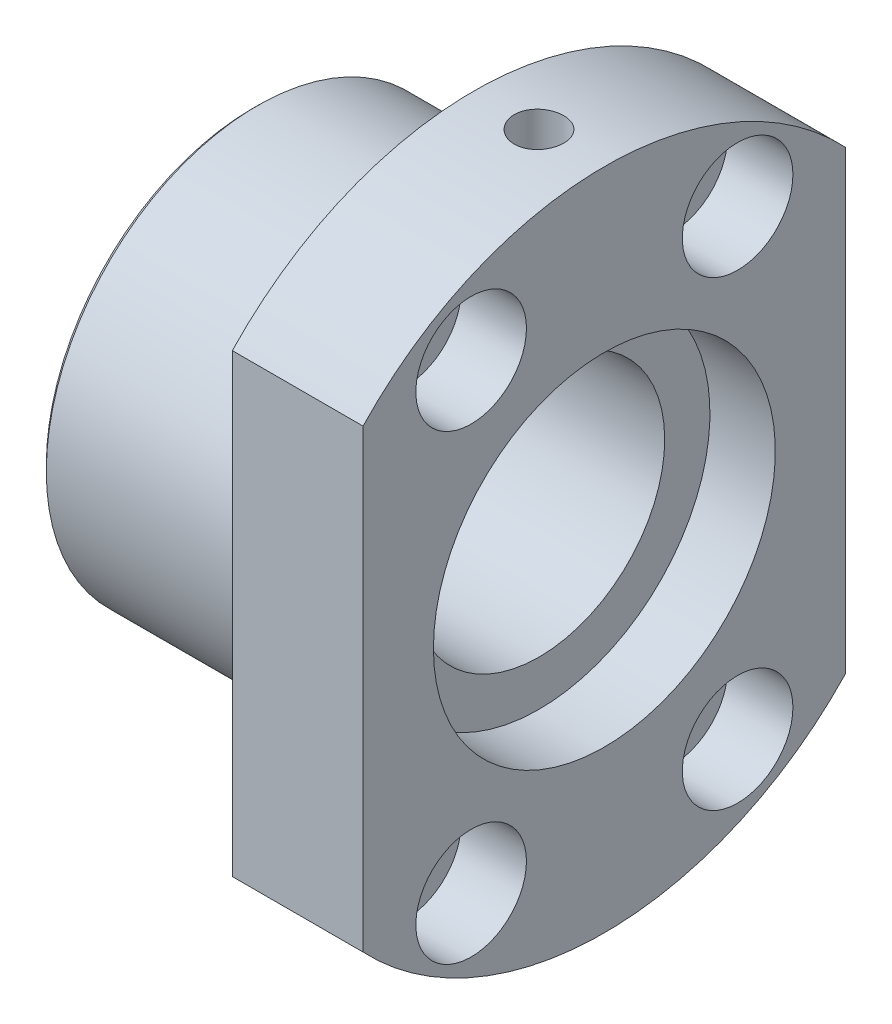
ISO-10303-21;
HEADER;
FILE_DESCRIPTION(('STEP AP214'),'2;1');
FILE_NAME('part.step','',(''),(''),'','','');
FILE_SCHEMA(('AUTOMOTIVE_DESIGN { 1 0 10303 214 1 1 1 1 }'));
ENDSEC;
DATA;
#1=APPLICATION_CONTEXT('core data for automotive mechanical design processes');
#2=APPLICATION_PROTOCOL_DEFINITION('international standard','automotive_design',2000,#1);
#3=PRODUCT_CONTEXT('',#1,'mechanical');
#4=PRODUCT('Part','Part','',(#3));
#5=PRODUCT_RELATED_PRODUCT_CATEGORY('part','',(#4));
#6=PRODUCT_DEFINITION_FORMATION('','',#4);
#7=PRODUCT_DEFINITION_CONTEXT('part definition',#1,'design');
#8=PRODUCT_DEFINITION('design','',#6,#7);
#9=PRODUCT_DEFINITION_SHAPE('','',#8);
#10=(LENGTH_UNIT() NAMED_UNIT(*) SI_UNIT(.MILLI.,.METRE.));
#11=(NAMED_UNIT(*) PLANE_ANGLE_UNIT() SI_UNIT($,.RADIAN.));
#12=(NAMED_UNIT(*) SI_UNIT($,.STERADIAN.) SOLID_ANGLE_UNIT());
#13=UNCERTAINTY_MEASURE_WITH_UNIT(LENGTH_MEASURE(1.E-05),#10,'distance_accuracy_value','');
#14=(GEOMETRIC_REPRESENTATION_CONTEXT(3) GLOBAL_UNCERTAINTY_ASSIGNED_CONTEXT((#13)) GLOBAL_UNIT_ASSIGNED_CONTEXT((#10,
#11,#12)) REPRESENTATION_CONTEXT('',''));
#15=CARTESIAN_POINT('',(0.,0.,0.));
#16=DIRECTION('',(0.,0.,1.));
#17=DIRECTION('',(1.,0.,0.));
#18=AXIS2_PLACEMENT_3D('',#15,#16,#17);
#19=CARTESIAN_POINT('',(13.,17.,0.));
#20=DIRECTION('',(-1.,0.,0.));
#21=DIRECTION('',(0.,0.,1.));
#22=AXIS2_PLACEMENT_3D('',#19,#20,#21);
#23=PLANE('',#22);
#24=CARTESIAN_POINT('',(13.,22.9496732002877,13.2499999999999));
#25=DIRECTION('',(1.,0.,0.));
#26=DIRECTION('',(0.,0.,-1.));
#27=AXIS2_PLACEMENT_3D('',#24,#25,#26);
#28=CIRCLE('',#27,5.5);
#29=CARTESIAN_POINT('',(13.,22.9496732002877,7.74999999999995));
#30=VERTEX_POINT('',#29);
#31=EDGE_CURVE('E192',#30,#30,#28,.T.);
#32=ORIENTED_EDGE('',*,*,#31,.F.);
#33=EDGE_LOOP('',(#32));
#34=FACE_BOUND('',#33,.T.);
#35=CARTESIAN_POINT('',(13.,-22.9496732002877,-13.2499999999999));
#36=DIRECTION('',(1.,0.,0.));
#37=DIRECTION('',(0.,0.,-1.));
#38=AXIS2_PLACEMENT_3D('',#35,#36,#37);
#39=CIRCLE('',#38,5.5);
#40=CARTESIAN_POINT('',(13.,-22.9496732002877,-18.7499999999999));
#41=VERTEX_POINT('',#40);
#42=EDGE_CURVE('E133',#41,#41,#39,.T.);
#43=ORIENTED_EDGE('',*,*,#42,.F.);
#44=EDGE_LOOP('',(#43));
#45=FACE_BOUND('',#44,.T.);
#46=CARTESIAN_POINT('',(13.,-22.9496732002877,13.2499999999999));
#47=DIRECTION('',(1.,0.,0.));
#48=DIRECTION('',(0.,0.,-1.));
#49=AXIS2_PLACEMENT_3D('',#46,#47,#48);
#50=CIRCLE('',#49,5.5);
#51=CARTESIAN_POINT('',(13.,-22.9496732002877,7.74999999999994));
#52=VERTEX_POINT('',#51);
#53=EDGE_CURVE('E129',#52,#52,#50,.T.);
#54=ORIENTED_EDGE('',*,*,#53,.F.);
#55=EDGE_LOOP('',(#54));
#56=FACE_BOUND('',#55,.T.);
#57=CARTESIAN_POINT('',(13.,22.9496732002877,-13.2499999999999));
#58=DIRECTION('',(1.,0.,0.));
#59=DIRECTION('',(0.,0.,-1.));
#60=AXIS2_PLACEMENT_3D('',#57,#58,#59);
#61=CIRCLE('',#60,5.5);
#62=CARTESIAN_POINT('',(13.,22.9496732002877,-18.7499999999999));
#63=VERTEX_POINT('',#62);
#64=EDGE_CURVE('E124',#63,#63,#61,.T.);
#65=ORIENTED_EDGE('',*,*,#64,.F.);
#66=EDGE_LOOP('',(#65));
#67=FACE_BOUND('',#66,.T.);
#68=CARTESIAN_POINT('',(13.,0.,0.));
#69=DIRECTION('',(-1.,0.,0.));
#70=DIRECTION('',(0.,0.,1.));
#71=AXIS2_PLACEMENT_3D('',#68,#69,#70);
#72=CIRCLE('',#71,17.);
#73=CARTESIAN_POINT('',(13.,0.,17.));
#74=VERTEX_POINT('',#73);
#75=EDGE_CURVE('E112',#74,#74,#72,.T.);
#76=ORIENTED_EDGE('',*,*,#75,.T.);
#77=EDGE_LOOP('',(#76));
#78=FACE_BOUND('',#77,.T.);
#79=DIRECTION('',(0.,1.,0.));
#80=VECTOR('',#79,1.);
#81=CARTESIAN_POINT('',(13.,22.6495033058122,24.));
#82=LINE('',#81,#80);
#83=CARTESIAN_POINT('',(13.,-22.6495033058122,24.));
#84=VERTEX_POINT('',#83);
#85=CARTESIAN_POINT('',(13.,22.6495033058122,24.));
#86=VERTEX_POINT('',#85);
#87=EDGE_CURVE('E221',#84,#86,#82,.T.);
#88=ORIENTED_EDGE('',*,*,#87,.F.);
#89=CARTESIAN_POINT('',(13.,0.,0.));
#90=DIRECTION('',(-1.,0.,0.));
#91=DIRECTION('',(0.,0.,1.));
#92=AXIS2_PLACEMENT_3D('',#89,#90,#91);
#93=CIRCLE('',#92,33.);
#94=CARTESIAN_POINT('',(13.,-22.6495033058122,-24.));
#95=VERTEX_POINT('',#94);
#96=EDGE_CURVE('E252',#95,#84,#93,.T.);
#97=ORIENTED_EDGE('',*,*,#96,.F.);
#98=DIRECTION('',(0.,-1.,0.));
#99=VECTOR('',#98,1.);
#100=CARTESIAN_POINT('',(13.,22.6495033058122,-24.));
#101=LINE('',#100,#99);
#102=CARTESIAN_POINT('',(13.,22.6495033058122,-24.));
#103=VERTEX_POINT('',#102);
#104=EDGE_CURVE('E229',#103,#95,#101,.T.);
#105=ORIENTED_EDGE('',*,*,#104,.F.);
#106=EDGE_CURVE('E251',#86,#103,#93,.T.);
#107=ORIENTED_EDGE('',*,*,#106,.F.);
#108=EDGE_LOOP('',(#88,#97,#105,#107));
#109=FACE_BOUND('',#108,.T.);
#110=ADVANCED_FACE('F38',(#34,#45,#56,#67,#78,#109),#23,.F.);
#111=CARTESIAN_POINT('',(-22.,0.,0.));
#112=DIRECTION('',(-1.,0.,0.));
#113=DIRECTION('',(0.,0.,1.));
#114=AXIS2_PLACEMENT_3D('',#111,#112,#113);
#115=CYLINDRICAL_SURFACE('',#114,33.);
#116=CARTESIAN_POINT('',(6.5,32.9082934493723,2.45849999999999));
#117=CARTESIAN_POINT('',(6.36211072310973,32.9082946699354,2.45849395554247));
#118=CARTESIAN_POINT('',(6.22412634389011,32.909169431109,2.4468603504253));
#119=CARTESIAN_POINT('',(5.95197187064766,32.9125741284232,2.40062094599061));
#120=CARTESIAN_POINT('',(5.81780633694077,32.9151059634182,2.36598879177929));
#121=CARTESIAN_POINT('',(5.55727087822319,32.9215364559457,2.27475629470783));
#122=CARTESIAN_POINT('',(5.43089671754116,32.9254343629884,2.21816801223258));
#123=CARTESIAN_POINT('',(5.18947209777319,32.9341568564213,2.0846501833518));
#124=CARTESIAN_POINT('',(5.07441914669097,32.9389812381851,2.00772512723169));
#125=CARTESIAN_POINT('',(4.85863226709642,32.949024381307,1.83554371970409));
#126=CARTESIAN_POINT('',(4.75792507407916,32.9542438519639,1.74025390041138));
#127=CARTESIAN_POINT('',(4.573917767419,32.9644825310211,1.53411810970013));
#128=CARTESIAN_POINT('',(4.4906183983204,32.9695017308482,1.4232714732449));
#129=CARTESIAN_POINT('',(4.34370490278924,32.9787808343987,1.18901232914212));
#130=CARTESIAN_POINT('',(4.28011352561674,32.9830398582522,1.06558551667617));
#131=CARTESIAN_POINT('',(4.17456669231542,32.9903111474799,0.809769670684546));
#132=CARTESIAN_POINT('',(4.13261092508598,32.993323430781,0.677380766056658));
#133=CARTESIAN_POINT('',(4.07160218937979,32.9977568974272,0.407661728874715));
#134=CARTESIAN_POINT('',(4.05250647564674,32.9991810500225,0.270341314602349));
#135=CARTESIAN_POINT('',(4.03762782418597,33.000287828097,-0.00556252705308268));
#136=CARTESIAN_POINT('',(4.04184453118983,32.9999704801157,-0.144145935156687));
#137=CARTESIAN_POINT('',(4.07343593511177,32.9976324755913,-0.418352198359179));
#138=CARTESIAN_POINT('',(4.1007646611158,32.9956152003135,-0.55398038261748));
#139=CARTESIAN_POINT('',(4.17773292426687,32.990108225695,-0.818719128845009));
#140=CARTESIAN_POINT('',(4.22737263721591,32.986618514752,-0.947829639448556));
#141=CARTESIAN_POINT('',(4.34760539813811,32.9785535870404,-1.19601495182105));
#142=CARTESIAN_POINT('',(4.41821914677925,32.9739772987558,-1.31507968897396));
#143=CARTESIAN_POINT('',(4.57838047463373,32.9642538391872,-1.53968377036035));
#144=CARTESIAN_POINT('',(4.66792835951918,32.9591066586874,-1.64522289619258));
#145=CARTESIAN_POINT('',(4.86367536729814,32.948805489728,-1.84004845659125));
#146=CARTESIAN_POINT('',(4.96991441529795,32.9436515151089,-1.92929478284312));
#147=CARTESIAN_POINT('',(5.19588853915754,32.9339302856172,-2.08869179093072));
#148=CARTESIAN_POINT('',(5.31562362317722,32.9293630310992,-2.15884246122085));
#149=CARTESIAN_POINT('',(5.56521792090346,32.921331297545,-2.27805470220127));
#150=CARTESIAN_POINT('',(5.69507804616747,32.9178669179437,-2.32711437147278));
#151=CARTESIAN_POINT('',(5.96122354515895,32.9124348924114,-2.40272321416931));
#152=CARTESIAN_POINT('',(6.09750881116892,32.9104672213976,-2.42927276483495));
#153=CARTESIAN_POINT('',(6.3722854988079,32.9082552589372,-2.45905732177606));
#154=CARTESIAN_POINT('',(6.51077083479517,32.9080068391994,-2.46234817757334));
#155=CARTESIAN_POINT('',(6.78632454536773,32.9092505990853,-2.44566805458085));
#156=CARTESIAN_POINT('',(6.92339293047385,32.9107427657759,-2.42569724863366));
#157=CARTESIAN_POINT('',(7.19206264295912,32.9152957914601,-2.36310718330613));
#158=CARTESIAN_POINT('',(7.32367003861883,32.9183548559447,-2.32051383062208));
#159=CARTESIAN_POINT('',(7.57786959140244,32.9256954750345,-2.21391403135507));
#160=CARTESIAN_POINT('',(7.70046163253541,32.929977045365,-2.14990730932794));
#161=CARTESIAN_POINT('',(7.93340655895207,32.9392902385685,-2.00215572230129));
#162=CARTESIAN_POINT('',(8.04373572129753,32.9443232725855,-1.91837354602358));
#163=CARTESIAN_POINT('',(8.24878364902832,32.9545674223103,-1.73350339550147));
#164=CARTESIAN_POINT('',(8.34350219906925,32.9597785404735,-1.63241518256394));
#165=CARTESIAN_POINT('',(8.51482991712342,32.9698038759424,-1.41556158142376));
#166=CARTESIAN_POINT('',(8.59140286530772,32.9746172871372,-1.29976753496271));
#167=CARTESIAN_POINT('',(8.72401755119631,32.9832932648045,-1.05693262178771));
#168=CARTESIAN_POINT('',(8.78005945837243,32.9871558391255,-0.929891847919721));
#169=CARTESIAN_POINT('',(8.86995866482826,32.9934911687097,-0.66830102981512));
#170=CARTESIAN_POINT('',(8.90383860216778,32.9959653418316,-0.533758801167109));
#171=CARTESIAN_POINT('',(8.94852617542714,32.9992508100677,-0.260876376241632));
#172=CARTESIAN_POINT('',(8.95933415173409,33.0000621297144,-0.12253623602632));
#173=CARTESIAN_POINT('',(8.95756737103736,32.9999305337729,0.153657376909556));
#174=CARTESIAN_POINT('',(8.945049166587,32.9989918609059,0.291511216957718));
#175=CARTESIAN_POINT('',(8.89710299518058,32.9954741840478,0.563153303360098));
#176=CARTESIAN_POINT('',(8.86167499241154,32.9928951774926,0.696941543358561));
#177=CARTESIAN_POINT('',(8.76892859330868,32.9863864233795,0.956660413552981));
#178=CARTESIAN_POINT('',(8.71161088351568,32.9824567181849,1.08259129004034));
#179=CARTESIAN_POINT('',(8.57671903548178,32.9736869266865,1.32305114096029));
#180=CARTESIAN_POINT('',(8.49914531115029,32.9688468589856,1.43758034830743));
#181=CARTESIAN_POINT('',(8.32573197616885,32.958786173908,1.65227447689513));
#182=CARTESIAN_POINT('',(8.22985081264208,32.9535647078372,1.75240579457489));
#183=CARTESIAN_POINT('',(8.02261320295718,32.9433368368239,1.9351905535852));
#184=CARTESIAN_POINT('',(7.91125299719158,32.9383304845169,2.01783973645435));
#185=CARTESIAN_POINT('',(7.6760435361837,32.9290910100926,2.16340239009177));
#186=CARTESIAN_POINT('',(7.55217483413066,32.9248591216641,2.22628448510513));
#187=CARTESIAN_POINT('',(7.29569304884121,32.9176630561565,2.33027928167191));
#188=CARTESIAN_POINT('',(7.16309030739649,32.9146974098214,2.37141722683486));
#189=CARTESIAN_POINT('',(6.94140974654999,32.911139005361,2.4201797469603));
#190=CARTESIAN_POINT('',(6.8537611183409,32.9100767640333,2.4345309796589));
#191=CARTESIAN_POINT('',(6.67742145196813,32.908653594054,2.45369304108728));
#192=CARTESIAN_POINT('',(6.58873041596091,32.9082926639518,2.45850388954994));
#193=CARTESIAN_POINT('',(6.5,32.9082934493723,2.45849999999999));
#194=B_SPLINE_CURVE_WITH_KNOTS('',3,(#116,#117,#118,#119,#120,#121,#122,#123,#124,#125,#126,
#127,#128,#129,#130,#131,#132,#133,#134,#135,#136,#137,#138,#139,#140,#141,#142,#143,#144,#145,
#146,#147,#148,#149,#150,#151,#152,#153,#154,#155,#156,#157,#158,#159,#160,#161,#162,#163,#164,
#165,#166,#167,#168,#169,#170,#171,#172,#173,#174,#175,#176,#177,#178,#179,#180,#181,#182,#183,
#184,#185,#186,#187,#188,#189,#190,#191,#192,#193),.UNSPECIFIED.,.T.,.F.,(4,2,2,2,2,2,2,2,2,2,2,
2,2,2,2,2,2,2,2,2,2,2,2,2,2,2,2,2,2,2,2,2,2,2,2,2,2,2,4),(0.,0.413343882810404,0.82716225101494,
1.24075363205448,1.65425376978349,2.06851471888367,2.48279338257797,2.89754848898646,
3.31229763142352,3.72627003076246,4.14023612140809,4.55338074499334,4.96652862405661,
5.38008562883824,5.79364931058163,6.20821773195932,6.62278640399256,7.03739244283632,
7.45199153327893,7.86559473584695,8.27919486521288,8.69232236949359,9.10545518811474,
9.51937380403192,9.93329812937271,10.3480418438947,10.7627821348709,11.1770981116621,
11.5914079758913,12.004714683988,12.4180220381743,12.8313164306034,13.2446023784765,
13.6588377695022,14.0731739479417,14.4881645082723,14.9026722262078,15.168655566924,
15.4346383574919),.UNSPECIFIED.);
#195=CARTESIAN_POINT('',(6.5,32.9082934493723,2.45849999999999));
#196=VERTEX_POINT('',#195);
#197=EDGE_CURVE('E187',#196,#196,#194,.T.);
#198=ORIENTED_EDGE('',*,*,#197,.T.);
#199=EDGE_LOOP('',(#198));
#200=FACE_BOUND('',#199,.T.);
#201=DIRECTION('',(-1.,0.,0.));
#202=VECTOR('',#201,1.);
#203=CARTESIAN_POINT('',(13.,22.6495033058122,24.));
#204=LINE('',#203,#202);
#205=CARTESIAN_POINT('',(0.,22.6495033058123,24.));
#206=VERTEX_POINT('',#205);
#207=EDGE_CURVE('E61',#86,#206,#204,.T.);
#208=ORIENTED_EDGE('',*,*,#207,.F.);
#209=ORIENTED_EDGE('',*,*,#106,.T.);
#210=DIRECTION('',(-1.,0.,0.));
#211=VECTOR('',#210,1.);
#212=CARTESIAN_POINT('',(13.,22.6495033058122,-24.));
#213=LINE('',#212,#211);
#214=CARTESIAN_POINT('',(0.,22.6495033058122,-24.));
#215=VERTEX_POINT('',#214);
#216=EDGE_CURVE('E235',#103,#215,#213,.T.);
#217=ORIENTED_EDGE('',*,*,#216,.T.);
#218=CARTESIAN_POINT('',(0.,0.,0.));
#219=DIRECTION('',(-1.,0.,0.));
#220=DIRECTION('',(0.,0.,1.));
#221=AXIS2_PLACEMENT_3D('',#218,#219,#220);
#222=CIRCLE('',#221,33.);
#223=EDGE_CURVE('E247',#206,#215,#222,.T.);
#224=ORIENTED_EDGE('',*,*,#223,.F.);
#225=EDGE_LOOP('',(#208,#209,#217,#224));
#226=FACE_BOUND('',#225,.T.);
#227=ADVANCED_FACE('F157',(#200,#226),#115,.T.);
#228=DIRECTION('',(-1.,0.,0.));
#229=VECTOR('',#228,1.);
#230=CARTESIAN_POINT('',(13.,-22.6495033058122,24.));
#231=LINE('',#230,#229);
#232=CARTESIAN_POINT('',(0.,-22.6495033058122,24.));
#233=VERTEX_POINT('',#232);
#234=EDGE_CURVE('E225',#84,#233,#231,.T.);
#235=ORIENTED_EDGE('',*,*,#234,.T.);
#236=CARTESIAN_POINT('',(0.,-22.6495033058123,-24.));
#237=VERTEX_POINT('',#236);
#238=EDGE_CURVE('E248',#237,#233,#222,.T.);
#239=ORIENTED_EDGE('',*,*,#238,.F.);
#240=DIRECTION('',(-1.,0.,0.));
#241=VECTOR('',#240,1.);
#242=CARTESIAN_POINT('',(13.,-22.6495033058122,-24.));
#243=LINE('',#242,#241);
#244=EDGE_CURVE('E231',#95,#237,#243,.T.);
#245=ORIENTED_EDGE('',*,*,#244,.F.);
#246=ORIENTED_EDGE('',*,*,#96,.T.);
#247=EDGE_LOOP('',(#235,#239,#245,#246));
#248=FACE_BOUND('',#247,.T.);
#249=ADVANCED_FACE('F151',(#248),#115,.T.);
#250=CARTESIAN_POINT('',(0.,33.,0.));
#251=DIRECTION('',(1.,0.,0.));
#252=DIRECTION('',(0.,0.,-1.));
#253=AXIS2_PLACEMENT_3D('',#250,#251,#252);
#254=PLANE('',#253);
#255=CARTESIAN_POINT('',(0.,22.9496732002877,13.2499999999999));
#256=DIRECTION('',(1.,0.,0.));
#257=DIRECTION('',(0.,0.,-1.));
#258=AXIS2_PLACEMENT_3D('',#255,#256,#257);
#259=CIRCLE('',#258,3.3);
#260=CARTESIAN_POINT('',(0.,22.9496732002877,9.94999999999995));
#261=VERTEX_POINT('',#260);
#262=EDGE_CURVE('E131',#261,#261,#259,.T.);
#263=ORIENTED_EDGE('',*,*,#262,.T.);
#264=EDGE_LOOP('',(#263));
#265=FACE_BOUND('',#264,.T.);
#266=CARTESIAN_POINT('',(0.,-22.9496732002877,-13.2499999999999));
#267=DIRECTION('',(1.,0.,0.));
#268=DIRECTION('',(0.,0.,-1.));
#269=AXIS2_PLACEMENT_3D('',#266,#267,#268);
#270=CIRCLE('',#269,3.3);
#271=CARTESIAN_POINT('',(0.,-22.9496732002877,-16.5499999999999));
#272=VERTEX_POINT('',#271);
#273=EDGE_CURVE('E126',#272,#272,#270,.T.);
#274=ORIENTED_EDGE('',*,*,#273,.T.);
#275=EDGE_LOOP('',(#274));
#276=FACE_BOUND('',#275,.T.);
#277=CARTESIAN_POINT('',(0.,-22.9496732002877,13.2499999999999));
#278=DIRECTION('',(1.,0.,0.));
#279=DIRECTION('',(0.,0.,-1.));
#280=AXIS2_PLACEMENT_3D('',#277,#278,#279);
#281=CIRCLE('',#280,3.3);
#282=CARTESIAN_POINT('',(0.,-22.9496732002877,9.94999999999995));
#283=VERTEX_POINT('',#282);
#284=EDGE_CURVE('E121',#283,#283,#281,.T.);
#285=ORIENTED_EDGE('',*,*,#284,.T.);
#286=EDGE_LOOP('',(#285));
#287=FACE_BOUND('',#286,.T.);
#288=CARTESIAN_POINT('',(0.,22.9496732002877,-13.2499999999999));
#289=DIRECTION('',(1.,0.,0.));
#290=DIRECTION('',(0.,0.,-1.));
#291=AXIS2_PLACEMENT_3D('',#288,#289,#290);
#292=CIRCLE('',#291,3.3);
#293=CARTESIAN_POINT('',(0.,22.9496732002877,-16.5499999999999));
#294=VERTEX_POINT('',#293);
#295=EDGE_CURVE('E116',#294,#294,#292,.T.);
#296=ORIENTED_EDGE('',*,*,#295,.T.);
#297=EDGE_LOOP('',(#296));
#298=FACE_BOUND('',#297,.T.);
#299=CARTESIAN_POINT('',(0.,0.,0.));
#300=DIRECTION('',(-1.,0.,0.));
#301=DIRECTION('',(0.,0.,1.));
#302=AXIS2_PLACEMENT_3D('',#299,#300,#301);
#303=CIRCLE('',#302,21.);
#304=CARTESIAN_POINT('',(0.,0.,21.));
#305=VERTEX_POINT('',#304);
#306=EDGE_CURVE('E244',#305,#305,#303,.T.);
#307=ORIENTED_EDGE('',*,*,#306,.F.);
#308=EDGE_LOOP('',(#307));
#309=FACE_BOUND('',#308,.T.);
#310=DIRECTION('',(0.,1.,0.));
#311=VECTOR('',#310,1.);
#312=CARTESIAN_POINT('',(0.,22.6495033058122,24.));
#313=LINE('',#312,#311);
#314=EDGE_CURVE('E119',#233,#206,#313,.T.);
#315=ORIENTED_EDGE('',*,*,#314,.T.);
#316=ORIENTED_EDGE('',*,*,#223,.T.);
#317=DIRECTION('',(0.,-1.,0.));
#318=VECTOR('',#317,1.);
#319=CARTESIAN_POINT('',(0.,22.6495033058122,-24.));
#320=LINE('',#319,#318);
#321=EDGE_CURVE('E228',#215,#237,#320,.T.);
#322=ORIENTED_EDGE('',*,*,#321,.T.);
#323=ORIENTED_EDGE('',*,*,#238,.T.);
#324=EDGE_LOOP('',(#315,#316,#322,#323));
#325=FACE_BOUND('',#324,.T.);
#326=ADVANCED_FACE('F145',(#265,#276,#287,#298,#309,#325),#254,.F.);
#327=CARTESIAN_POINT('',(-17.,17.,0.));
#328=DIRECTION('',(1.,0.,0.));
#329=DIRECTION('',(0.,0.,-1.));
#330=AXIS2_PLACEMENT_3D('',#327,#328,#329);
#331=PLANE('',#330);
#332=CARTESIAN_POINT('',(-17.,0.,0.));
#333=DIRECTION('',(-1.,0.,0.));
#334=DIRECTION('',(0.,0.,1.));
#335=AXIS2_PLACEMENT_3D('',#332,#333,#334);
#336=CIRCLE('',#335,12.5);
#337=CARTESIAN_POINT('',(-17.,0.,12.5));
#338=VERTEX_POINT('',#337);
#339=EDGE_CURVE('E97',#338,#338,#336,.T.);
#340=ORIENTED_EDGE('',*,*,#339,.F.);
#341=EDGE_LOOP('',(#340));
#342=FACE_BOUND('',#341,.T.);
#343=CARTESIAN_POINT('',(-17.,0.,0.));
#344=DIRECTION('',(-1.,0.,0.));
#345=DIRECTION('',(0.,0.,1.));
#346=AXIS2_PLACEMENT_3D('',#343,#344,#345);
#347=CIRCLE('',#346,17.);
#348=CARTESIAN_POINT('',(-17.,0.,17.));
#349=VERTEX_POINT('',#348);
#350=EDGE_CURVE('E238',#349,#349,#347,.T.);
#351=ORIENTED_EDGE('',*,*,#350,.T.);
#352=EDGE_LOOP('',(#351));
#353=FACE_BOUND('',#352,.T.);
#354=ADVANCED_FACE('F143',(#342,#353),#331,.F.);
#355=CARTESIAN_POINT('',(-22.,0.,0.));
#356=DIRECTION('',(-1.,0.,0.));
#357=DIRECTION('',(0.,0.,1.));
#358=AXIS2_PLACEMENT_3D('',#355,#356,#357);
#359=CYLINDRICAL_SURFACE('',#358,12.5);
#360=CARTESIAN_POINT('',(6.5,0.,0.));
#361=DIRECTION('',(-1.,0.,0.));
#362=DIRECTION('',(0.,0.,1.));
#363=AXIS2_PLACEMENT_3D('',#360,#361,#362);
#364=CIRCLE('',#363,12.5);
#365=CARTESIAN_POINT('',(6.5,12.2558466761787,-2.45849999999999));
#366=VERTEX_POINT('',#365);
#367=CARTESIAN_POINT('',(6.5,12.2558466761787,2.45849999999999));
#368=VERTEX_POINT('',#367);
#369=EDGE_CURVE('E102',#366,#368,#364,.T.);
#370=ORIENTED_EDGE('',*,*,#369,.F.);
#371=CARTESIAN_POINT('',(6.5,12.2558466761787,-2.45849999999999));
#372=CARTESIAN_POINT('',(6.43156630906929,12.2558408562407,-2.45850740101312));
#373=CARTESIAN_POINT('',(6.36313668865804,12.2564197249348,-2.45564274897426));
#374=CARTESIAN_POINT('',(6.22678042126216,12.2587037498149,-2.44422674169258));
#375=CARTESIAN_POINT('',(6.15885371435433,12.2604087695604,-2.43567607534634));
#376=CARTESIAN_POINT('',(6.02408198219191,12.2648986716831,-2.41296238647563));
#377=CARTESIAN_POINT('',(5.957235493286,12.2676819378859,-2.39880776298085));
#378=CARTESIAN_POINT('',(5.82501333424325,12.2742419663273,-2.36501119684474));
#379=CARTESIAN_POINT('',(5.7596376692975,12.2780187320716,-2.34536923483976));
#380=CARTESIAN_POINT('',(5.56638769264046,12.2906858987379,-2.27840619431559));
#381=CARTESIAN_POINT('',(5.44128535647636,12.3009169207358,-2.22303012144547));
#382=CARTESIAN_POINT('',(5.2021997588487,12.3237916742935,-2.09249146978534));
#383=CARTESIAN_POINT('',(5.08821754308917,12.3364356324289,-2.01732703260804));
#384=CARTESIAN_POINT('',(4.87298775753427,12.3629040841784,-1.84824125608597));
#385=CARTESIAN_POINT('',(4.77191168115096,12.3767410514495,-1.75410318063594));
#386=CARTESIAN_POINT('',(4.5868759399709,12.4039275953023,-1.55020634088652));
#387=CARTESIAN_POINT('',(4.50291892357028,12.417277096209,-1.44044516407588));
#388=CARTESIAN_POINT('',(4.35383952926279,12.4421187303087,-1.20727833746271));
#389=CARTESIAN_POINT('',(4.28888131170732,12.4535943170624,-1.08376580404186));
#390=CARTESIAN_POINT('',(4.18070733521727,12.4732534186503,-0.827323407179777));
#391=CARTESIAN_POINT('',(4.13748842168666,12.4814374110941,-0.694394913286571));
#392=CARTESIAN_POINT('',(4.07455240192855,12.4935033116097,-0.424684656237872));
#393=CARTESIAN_POINT('',(4.05454292973566,12.4974386940092,-0.287973548597447));
#394=CARTESIAN_POINT('',(4.0376819608935,12.5007485907706,-0.013078733077211));
#395=CARTESIAN_POINT('',(4.04082884171306,12.5001234246833,0.125104870949494));
#396=CARTESIAN_POINT('',(4.06996965621608,12.4944240221342,0.397007351619459));
#397=CARTESIAN_POINT('',(4.09564811160512,12.48941122199,0.530761514125792));
#398=CARTESIAN_POINT('',(4.16862297338728,12.4755690375432,0.792023670142397));
#399=CARTESIAN_POINT('',(4.21592006853256,12.466739531644,0.919531464505188));
#400=CARTESIAN_POINT('',(4.33108492435403,12.4461542301623,1.16558847983913));
#401=CARTESIAN_POINT('',(4.39907729727738,12.4343807871399,1.28407784003054));
#402=CARTESIAN_POINT('',(4.55360852412221,12.4092071798129,1.50807848443571));
#403=CARTESIAN_POINT('',(4.64014883817175,12.3958068874757,1.61358874588109));
#404=CARTESIAN_POINT('',(4.83103930342329,12.3685954330801,1.81049960564178));
#405=CARTESIAN_POINT('',(4.93566342115664,12.3547811483995,1.90163434566304));
#406=CARTESIAN_POINT('',(5.15888280171779,12.3285081920908,2.06513100501283));
#407=CARTESIAN_POINT('',(5.27748193095447,12.3160498974614,2.13748771128474));
#408=CARTESIAN_POINT('',(5.5256760669797,12.2938917056157,2.26146380050525));
#409=CARTESIAN_POINT('',(5.6552985632426,12.2841989834092,2.31302938338019));
#410=CARTESIAN_POINT('',(5.92151749374829,12.2687756488272,2.39350188909479));
#411=CARTESIAN_POINT('',(6.05810321156811,12.2630391343996,2.42244257344792));
#412=CARTESIAN_POINT('',(6.24647961668466,12.2583634178784,2.44592504587553));
#413=CARTESIAN_POINT('',(6.29710856807544,12.2574206560674,2.45064232247084));
#414=CARTESIAN_POINT('',(6.39848409399796,12.2561628201477,2.45692583329426));
#415=CARTESIAN_POINT('',(6.4492303282145,12.25584669459,2.45849734592371));
#416=CARTESIAN_POINT('',(6.5,12.2558466761787,2.45849999999999));
#417=B_SPLINE_CURVE_WITH_KNOTS('',3,(#371,#372,#373,#374,#375,#376,#377,#378,#379,#380,#381,
#382,#383,#384,#385,#386,#387,#388,#389,#390,#391,#392,#393,#394,#395,#396,#397,#398,#399,#400,
#401,#402,#403,#404,#405,#406,#407,#408,#409,#410,#411,#412,#413,#414,#415,#416),.UNSPECIFIED.,
.F.,.F.,(4,2,2,2,2,2,2,2,2,2,2,2,2,2,2,2,2,2,2,2,2,2,4),(0.,0.205231573748787,0.410438286924593,
0.615338600195901,0.8202396365257,1.22972589497914,1.63925062329644,2.05374952190112,
2.46831249679174,2.88635832039942,3.30434346375635,3.71700407911741,4.12963578023903,
4.53658054659499,4.94353827878173,5.35299659306736,5.7624871525124,6.17883480388046,
6.59529791609629,7.01283187600178,7.4297415842857,7.58223465658674,7.73447163954562),.UNSPECIFIED.);
#418=EDGE_CURVE('E88',#366,#368,#417,.T.);
#419=ORIENTED_EDGE('',*,*,#418,.T.);
#420=EDGE_LOOP('',(#370,#419));
#421=FACE_BOUND('',#420,.T.);
#422=ORIENTED_EDGE('',*,*,#339,.T.);
#423=EDGE_LOOP('',(#422));
#424=FACE_BOUND('',#423,.T.);
#425=ADVANCED_FACE('F107',(#421,#424),#359,.F.);
#426=CARTESIAN_POINT('',(6.5,17.,0.));
#427=DIRECTION('',(-1.,0.,0.));
#428=DIRECTION('',(0.,0.,1.));
#429=AXIS2_PLACEMENT_3D('',#426,#427,#428);
#430=PLANE('',#429);
#431=ORIENTED_EDGE('',*,*,#369,.T.);
#432=DIRECTION('',(0.,1.,0.));
#433=VECTOR('',#432,1.);
#434=CARTESIAN_POINT('',(6.5,33.,2.45849999999999));
#435=LINE('',#434,#433);
#436=CARTESIAN_POINT('',(6.5,16.8212894199583,2.45849999999999));
#437=VERTEX_POINT('',#436);
#438=EDGE_CURVE('E53',#368,#437,#435,.T.);
#439=ORIENTED_EDGE('',*,*,#438,.T.);
#440=CARTESIAN_POINT('',(6.5,0.,0.));
#441=DIRECTION('',(-1.,0.,0.));
#442=DIRECTION('',(0.,0.,1.));
#443=AXIS2_PLACEMENT_3D('',#440,#441,#442);
#444=CIRCLE('',#443,17.);
#445=CARTESIAN_POINT('',(6.5,16.8212894199583,-2.45849999999999));
#446=VERTEX_POINT('',#445);
#447=EDGE_CURVE('E104',#446,#437,#444,.T.);
#448=ORIENTED_EDGE('',*,*,#447,.F.);
#449=DIRECTION('',(0.,1.,0.));
#450=VECTOR('',#449,1.);
#451=CARTESIAN_POINT('',(6.5,33.,-2.45849999999999));
#452=LINE('',#451,#450);
#453=EDGE_CURVE('E92',#446,#366,#452,.F.);
#454=ORIENTED_EDGE('',*,*,#453,.T.);
#455=EDGE_LOOP('',(#431,#439,#448,#454));
#456=FACE_BOUND('',#455,.T.);
#457=ADVANCED_FACE('F101',(#456),#430,.F.);
#458=CARTESIAN_POINT('',(-22.,0.,0.));
#459=DIRECTION('',(-1.,0.,0.));
#460=DIRECTION('',(0.,0.,1.));
#461=AXIS2_PLACEMENT_3D('',#458,#459,#460);
#462=CYLINDRICAL_SURFACE('',#461,17.);
#463=ORIENTED_EDGE('',*,*,#75,.F.);
#464=EDGE_LOOP('',(#463));
#465=FACE_BOUND('',#464,.T.);
#466=ORIENTED_EDGE('',*,*,#447,.T.);
#467=CARTESIAN_POINT('',(6.5,16.8212894199583,2.45849999999999));
#468=CARTESIAN_POINT('',(6.56876258203181,16.8212852238117,2.45850704497961));
#469=CARTESIAN_POINT('',(6.63752152705267,16.8217109648702,2.45561519124289));
#470=CARTESIAN_POINT('',(6.77454032373908,16.8233912934825,2.4440882725063));
#471=CARTESIAN_POINT('',(6.84280021830811,16.8246458089187,2.43545370722063));
#472=CARTESIAN_POINT('',(6.97826456786958,16.827950798074,2.41250891873919));
#473=CARTESIAN_POINT('',(7.04547012942161,16.8300003698064,2.3982051268499));
#474=CARTESIAN_POINT('',(7.17840784307038,16.8348327397385,2.36404347107092));
#475=CARTESIAN_POINT('',(7.24414000077929,16.837615535145,2.34418562834043));
#476=CARTESIAN_POINT('',(7.43846958393466,16.8469532962356,2.27646088596191));
#477=CARTESIAN_POINT('',(7.56428336599163,16.8544998115785,2.22042857860758));
#478=CARTESIAN_POINT('',(7.80465000520404,16.8713798110759,2.08828859481643));
#479=CARTESIAN_POINT('',(7.91920329332601,16.880713226801,2.01218168709439));
#480=CARTESIAN_POINT('',(8.13473203498191,16.9001930874613,1.8414359189551));
#481=CARTESIAN_POINT('',(8.23561353188331,16.9103444622208,1.74667881477821));
#482=CARTESIAN_POINT('',(8.42010722051353,16.9302732214334,1.54157220703));
#483=CARTESIAN_POINT('',(8.50371677502069,16.9400505485883,1.43122032664612));
#484=CARTESIAN_POINT('',(8.65163588174105,16.9581804736531,1.19745493734476));
#485=CARTESIAN_POINT('',(8.71585815056884,16.9665265573078,1.07398564451231));
#486=CARTESIAN_POINT('',(8.8226145661423,16.9807980148866,0.817879678442617));
#487=CARTESIAN_POINT('',(8.86515104098421,16.9867236486466,0.685243991008001));
#488=CARTESIAN_POINT('',(8.92704632188812,16.9954520709262,0.415544078338746));
#489=CARTESIAN_POINT('',(8.94656453967835,16.9982763283594,0.278517144073064));
#490=CARTESIAN_POINT('',(8.96236399319864,17.0005573331239,0.00310256261962707));
#491=CARTESIAN_POINT('',(8.9586458762404,17.0000141742637,-0.135285046555576));
#492=CARTESIAN_POINT('',(8.92820364888456,16.9956386238117,-0.408398456762766));
#493=CARTESIAN_POINT('',(8.90165166400067,16.9918308421433,-0.54314389372129));
#494=CARTESIAN_POINT('',(8.82656546818684,16.9813813735333,-0.806245505578384));
#495=CARTESIAN_POINT('',(8.7780308528379,16.974739634455,-0.934601562881997));
#496=CARTESIAN_POINT('',(8.66017839201717,16.9593260278102,-1.18180764686119));
#497=CARTESIAN_POINT('',(8.59078723483196,16.9505466674263,-1.30062223667668));
#498=CARTESIAN_POINT('',(8.43324759563323,16.9318376543583,-1.52498082873583));
#499=CARTESIAN_POINT('',(8.34509871545951,16.921907977259,-1.63052454921013));
#500=CARTESIAN_POINT('',(8.15159955154372,16.90190034446,-1.82635146321933));
#501=CARTESIAN_POINT('',(8.0461012956037,16.8918218591448,-1.91648843361298));
#502=CARTESIAN_POINT('',(7.82135949953408,16.8727371106882,-2.07782722575365));
#503=CARTESIAN_POINT('',(7.70211196745957,16.8637311604957,-2.14902352835067));
#504=CARTESIAN_POINT('',(7.45309294262367,16.8478101745754,-2.27047654056975));
#505=CARTESIAN_POINT('',(7.32330831518247,16.8408978008904,-2.32070662145289));
#506=CARTESIAN_POINT('',(7.05711481462104,16.829989903247,-2.39854343891687));
#507=CARTESIAN_POINT('',(6.92071620905752,16.8259900033931,-2.42618412299757));
#508=CARTESIAN_POINT('',(6.73609292559341,16.8228795676625,-2.44759815220925));
#509=CARTESIAN_POINT('',(6.68892713437737,16.822283731883,-2.45168818951424));
#510=CARTESIAN_POINT('',(6.59451431684683,16.8214890953872,-2.4571354956642));
#511=CARTESIAN_POINT('',(6.54726756116004,16.8212896276344,-2.45849735571243));
#512=CARTESIAN_POINT('',(6.5,16.8212894199583,-2.45849999999999));
#513=B_SPLINE_CURVE_WITH_KNOTS('',3,(#467,#468,#469,#470,#471,#472,#473,#474,#475,#476,#477,
#478,#479,#480,#481,#482,#483,#484,#485,#486,#487,#488,#489,#490,#491,#492,#493,#494,#495,#496,
#497,#498,#499,#500,#501,#502,#503,#504,#505,#506,#507,#508,#509,#510,#511,#512),.UNSPECIFIED.,
.F.,.F.,(4,2,2,2,2,2,2,2,2,2,2,2,2,2,2,2,2,2,2,2,2,2,4),(0.,0.206219201951192,0.412420461649624,
0.618388468172321,0.824355690031666,1.2360398962927,1.6477083402573,2.06207613893917,
2.47650716000329,2.89277707884671,3.30900229927522,3.72232772297848,4.13564163242237,
4.5458669530527,4.95609982098948,5.36779188394387,5.7794926865386,6.19490669718628,
6.61044162369665,7.0265027178438,7.44193739678032,7.58391763008124,7.72565872585498),.UNSPECIFIED.);
#514=EDGE_CURVE('E105',#437,#446,#513,.T.);
#515=ORIENTED_EDGE('',*,*,#514,.T.);
#516=EDGE_LOOP('',(#466,#515));
#517=FACE_BOUND('',#516,.T.);
#518=ADVANCED_FACE('F169',(#465,#517),#462,.F.);
#519=CARTESIAN_POINT('',(-22.,0.,0.));
#520=DIRECTION('',(-1.,0.,0.));
#521=DIRECTION('',(0.,0.,1.));
#522=AXIS2_PLACEMENT_3D('',#519,#520,#521);
#523=CYLINDRICAL_SURFACE('',#522,21.);
#524=CARTESIAN_POINT('',(-21.5,0.,0.));
#525=DIRECTION('',(1.,0.,0.));
#526=DIRECTION('',(0.,0.,-1.));
#527=AXIS2_PLACEMENT_3D('',#524,#525,#526);
#528=CIRCLE('',#527,21.);
#529=CARTESIAN_POINT('',(-21.5,0.,-21.));
#530=VERTEX_POINT('',#529);
#531=EDGE_CURVE('E11',#530,#530,#528,.T.);
#532=ORIENTED_EDGE('',*,*,#531,.T.);
#533=EDGE_LOOP('',(#532));
#534=FACE_BOUND('',#533,.T.);
#535=ORIENTED_EDGE('',*,*,#306,.T.);
#536=EDGE_LOOP('',(#535));
#537=FACE_BOUND('',#536,.T.);
#538=ADVANCED_FACE('F172',(#534,#537),#523,.T.);
#539=CARTESIAN_POINT('',(-22.,21.,0.));
#540=DIRECTION('',(1.,0.,0.));
#541=DIRECTION('',(0.,0.,-1.));
#542=AXIS2_PLACEMENT_3D('',#539,#540,#541);
#543=PLANE('',#542);
#544=CARTESIAN_POINT('',(-22.,0.,0.));
#545=DIRECTION('',(1.,0.,0.));
#546=DIRECTION('',(0.,0.,-1.));
#547=AXIS2_PLACEMENT_3D('',#544,#545,#546);
#548=CIRCLE('',#547,20.5);
#549=CARTESIAN_POINT('',(-22.,0.,-20.5));
#550=VERTEX_POINT('',#549);
#551=EDGE_CURVE('E46',#550,#550,#548,.F.);
#552=ORIENTED_EDGE('',*,*,#551,.T.);
#553=EDGE_LOOP('',(#552));
#554=FACE_BOUND('',#553,.T.);
#555=CARTESIAN_POINT('',(-22.,0.,0.));
#556=DIRECTION('',(-1.,0.,0.));
#557=DIRECTION('',(0.,0.,1.));
#558=AXIS2_PLACEMENT_3D('',#555,#556,#557);
#559=CIRCLE('',#558,17.);
#560=CARTESIAN_POINT('',(-22.,0.,17.));
#561=VERTEX_POINT('',#560);
#562=EDGE_CURVE('E241',#561,#561,#559,.T.);
#563=ORIENTED_EDGE('',*,*,#562,.F.);
#564=EDGE_LOOP('',(#563));
#565=FACE_BOUND('',#564,.T.);
#566=ADVANCED_FACE('F290',(#554,#565),#543,.F.);
#567=CARTESIAN_POINT('',(-22.,0.,0.));
#568=DIRECTION('',(-1.,0.,0.));
#569=DIRECTION('',(0.,0.,1.));
#570=AXIS2_PLACEMENT_3D('',#567,#568,#569);
#571=CYLINDRICAL_SURFACE('',#570,17.);
#572=ORIENTED_EDGE('',*,*,#350,.F.);
#573=EDGE_LOOP('',(#572));
#574=FACE_BOUND('',#573,.T.);
#575=ORIENTED_EDGE('',*,*,#562,.T.);
#576=EDGE_LOOP('',(#575));
#577=FACE_BOUND('',#576,.T.);
#578=ADVANCED_FACE('F284',(#574,#577),#571,.F.);
#579=CARTESIAN_POINT('',(13.,22.6495033058122,-24.));
#580=DIRECTION('',(0.,0.,-1.));
#581=DIRECTION('',(-1.,0.,0.));
#582=AXIS2_PLACEMENT_3D('',#579,#580,#581);
#583=PLANE('',#582);
#584=ORIENTED_EDGE('',*,*,#321,.F.);
#585=ORIENTED_EDGE('',*,*,#216,.F.);
#586=ORIENTED_EDGE('',*,*,#104,.T.);
#587=ORIENTED_EDGE('',*,*,#244,.T.);
#588=EDGE_LOOP('',(#584,#585,#586,#587));
#589=FACE_BOUND('',#588,.T.);
#590=ADVANCED_FACE('F268',(#589),#583,.T.);
#591=CARTESIAN_POINT('',(13.,22.6495033058122,24.));
#592=DIRECTION('',(0.,0.,1.));
#593=DIRECTION('',(1.,0.,0.));
#594=AXIS2_PLACEMENT_3D('',#591,#592,#593);
#595=PLANE('',#594);
#596=ORIENTED_EDGE('',*,*,#314,.F.);
#597=ORIENTED_EDGE('',*,*,#234,.F.);
#598=ORIENTED_EDGE('',*,*,#87,.T.);
#599=ORIENTED_EDGE('',*,*,#207,.T.);
#600=EDGE_LOOP('',(#596,#597,#598,#599));
#601=FACE_BOUND('',#600,.T.);
#602=ADVANCED_FACE('F273',(#601),#595,.T.);
#603=CARTESIAN_POINT('',(13.,22.9496732002877,-13.2499999999999));
#604=DIRECTION('',(1.,0.,0.));
#605=DIRECTION('',(0.,0.,-1.));
#606=AXIS2_PLACEMENT_3D('',#603,#604,#605);
#607=CYLINDRICAL_SURFACE('',#606,3.3);
#608=CARTESIAN_POINT('',(6.5,22.9496732002877,-13.2499999999999));
#609=DIRECTION('',(1.,0.,0.));
#610=DIRECTION('',(0.,0.,-1.));
#611=AXIS2_PLACEMENT_3D('',#608,#609,#610);
#612=CIRCLE('',#611,3.3);
#613=CARTESIAN_POINT('',(6.5,22.9496732002877,-16.5499999999999));
#614=VERTEX_POINT('',#613);
#615=EDGE_CURVE('E120',#614,#614,#612,.T.);
#616=ORIENTED_EDGE('',*,*,#615,.T.);
#617=EDGE_LOOP('',(#616));
#618=FACE_BOUND('',#617,.T.);
#619=ORIENTED_EDGE('',*,*,#295,.F.);
#620=EDGE_LOOP('',(#619));
#621=FACE_BOUND('',#620,.T.);
#622=ADVANCED_FACE('F275',(#618,#621),#607,.F.);
#623=CARTESIAN_POINT('',(6.5,26.2496732002877,-13.2499999999999));
#624=DIRECTION('',(-1.,0.,0.));
#625=DIRECTION('',(0.,0.,1.));
#626=AXIS2_PLACEMENT_3D('',#623,#624,#625);
#627=PLANE('',#626);
#628=ORIENTED_EDGE('',*,*,#615,.F.);
#629=EDGE_LOOP('',(#628));
#630=FACE_BOUND('',#629,.T.);
#631=CARTESIAN_POINT('',(6.5,22.9496732002877,-13.2499999999999));
#632=DIRECTION('',(1.,0.,0.));
#633=DIRECTION('',(0.,0.,-1.));
#634=AXIS2_PLACEMENT_3D('',#631,#632,#633);
#635=CIRCLE('',#634,5.5);
#636=CARTESIAN_POINT('',(6.5,22.9496732002877,-18.7499999999999));
#637=VERTEX_POINT('',#636);
#638=EDGE_CURVE('E216',#637,#637,#635,.T.);
#639=ORIENTED_EDGE('',*,*,#638,.T.);
#640=EDGE_LOOP('',(#639));
#641=FACE_BOUND('',#640,.T.);
#642=ADVANCED_FACE('F281',(#630,#641),#627,.F.);
#643=CARTESIAN_POINT('',(13.,22.9496732002877,-13.2499999999999));
#644=DIRECTION('',(1.,0.,0.));
#645=DIRECTION('',(0.,0.,-1.));
#646=AXIS2_PLACEMENT_3D('',#643,#644,#645);
#647=CYLINDRICAL_SURFACE('',#646,5.5);
#648=ORIENTED_EDGE('',*,*,#638,.F.);
#649=EDGE_LOOP('',(#648));
#650=FACE_BOUND('',#649,.T.);
#651=ORIENTED_EDGE('',*,*,#64,.T.);
#652=EDGE_LOOP('',(#651));
#653=FACE_BOUND('',#652,.T.);
#654=ADVANCED_FACE('F387',(#650,#653),#647,.F.);
#655=CARTESIAN_POINT('',(13.,-22.9496732002877,13.2499999999999));
#656=DIRECTION('',(1.,0.,0.));
#657=DIRECTION('',(0.,0.,-1.));
#658=AXIS2_PLACEMENT_3D('',#655,#656,#657);
#659=CYLINDRICAL_SURFACE('',#658,3.3);
#660=CARTESIAN_POINT('',(6.5,-22.9496732002877,13.2499999999999));
#661=DIRECTION('',(1.,0.,0.));
#662=DIRECTION('',(0.,0.,-1.));
#663=AXIS2_PLACEMENT_3D('',#660,#661,#662);
#664=CIRCLE('',#663,3.3);
#665=CARTESIAN_POINT('',(6.5,-22.9496732002877,9.94999999999994));
#666=VERTEX_POINT('',#665);
#667=EDGE_CURVE('E125',#666,#666,#664,.T.);
#668=ORIENTED_EDGE('',*,*,#667,.T.);
#669=EDGE_LOOP('',(#668));
#670=FACE_BOUND('',#669,.T.);
#671=ORIENTED_EDGE('',*,*,#284,.F.);
#672=EDGE_LOOP('',(#671));
#673=FACE_BOUND('',#672,.T.);
#674=ADVANCED_FACE('F379',(#670,#673),#659,.F.);
#675=CARTESIAN_POINT('',(6.5,-19.6496732002877,13.2499999999999));
#676=DIRECTION('',(-1.,0.,0.));
#677=DIRECTION('',(0.,0.,1.));
#678=AXIS2_PLACEMENT_3D('',#675,#676,#677);
#679=PLANE('',#678);
#680=ORIENTED_EDGE('',*,*,#667,.F.);
#681=EDGE_LOOP('',(#680));
#682=FACE_BOUND('',#681,.T.);
#683=CARTESIAN_POINT('',(6.5,-22.9496732002877,13.2499999999999));
#684=DIRECTION('',(1.,0.,0.));
#685=DIRECTION('',(0.,0.,-1.));
#686=AXIS2_PLACEMENT_3D('',#683,#684,#685);
#687=CIRCLE('',#686,5.5);
#688=CARTESIAN_POINT('',(6.5,-22.9496732002877,7.74999999999995));
#689=VERTEX_POINT('',#688);
#690=EDGE_CURVE('E209',#689,#689,#687,.T.);
#691=ORIENTED_EDGE('',*,*,#690,.T.);
#692=EDGE_LOOP('',(#691));
#693=FACE_BOUND('',#692,.T.);
#694=ADVANCED_FACE('F371',(#682,#693),#679,.F.);
#695=CARTESIAN_POINT('',(13.,-22.9496732002877,13.2499999999999));
#696=DIRECTION('',(1.,0.,0.));
#697=DIRECTION('',(0.,0.,-1.));
#698=AXIS2_PLACEMENT_3D('',#695,#696,#697);
#699=CYLINDRICAL_SURFACE('',#698,5.5);
#700=ORIENTED_EDGE('',*,*,#690,.F.);
#701=EDGE_LOOP('',(#700));
#702=FACE_BOUND('',#701,.T.);
#703=ORIENTED_EDGE('',*,*,#53,.T.);
#704=EDGE_LOOP('',(#703));
#705=FACE_BOUND('',#704,.T.);
#706=ADVANCED_FACE('F363',(#702,#705),#699,.F.);
#707=CARTESIAN_POINT('',(13.,-22.9496732002877,-13.2499999999999));
#708=DIRECTION('',(1.,0.,0.));
#709=DIRECTION('',(0.,0.,-1.));
#710=AXIS2_PLACEMENT_3D('',#707,#708,#709);
#711=CYLINDRICAL_SURFACE('',#710,3.3);
#712=CARTESIAN_POINT('',(6.5,-22.9496732002877,-13.2499999999999));
#713=DIRECTION('',(1.,0.,0.));
#714=DIRECTION('',(0.,0.,-1.));
#715=AXIS2_PLACEMENT_3D('',#712,#713,#714);
#716=CIRCLE('',#715,3.3);
#717=CARTESIAN_POINT('',(6.5,-22.9496732002877,-16.5499999999999));
#718=VERTEX_POINT('',#717);
#719=EDGE_CURVE('E130',#718,#718,#716,.T.);
#720=ORIENTED_EDGE('',*,*,#719,.T.);
#721=EDGE_LOOP('',(#720));
#722=FACE_BOUND('',#721,.T.);
#723=ORIENTED_EDGE('',*,*,#273,.F.);
#724=EDGE_LOOP('',(#723));
#725=FACE_BOUND('',#724,.T.);
#726=ADVANCED_FACE('F355',(#722,#725),#711,.F.);
#727=CARTESIAN_POINT('',(6.5,-19.6496732002877,-13.2499999999999));
#728=DIRECTION('',(-1.,0.,0.));
#729=DIRECTION('',(0.,0.,1.));
#730=AXIS2_PLACEMENT_3D('',#727,#728,#729);
#731=PLANE('',#730);
#732=ORIENTED_EDGE('',*,*,#719,.F.);
#733=EDGE_LOOP('',(#732));
#734=FACE_BOUND('',#733,.T.);
#735=CARTESIAN_POINT('',(6.5,-22.9496732002877,-13.2499999999999));
#736=DIRECTION('',(1.,0.,0.));
#737=DIRECTION('',(0.,0.,-1.));
#738=AXIS2_PLACEMENT_3D('',#735,#736,#737);
#739=CIRCLE('',#738,5.5);
#740=CARTESIAN_POINT('',(6.5,-22.9496732002877,-18.7499999999999));
#741=VERTEX_POINT('',#740);
#742=EDGE_CURVE('E202',#741,#741,#739,.T.);
#743=ORIENTED_EDGE('',*,*,#742,.T.);
#744=EDGE_LOOP('',(#743));
#745=FACE_BOUND('',#744,.T.);
#746=ADVANCED_FACE('F347',(#734,#745),#731,.F.);
#747=CARTESIAN_POINT('',(13.,-22.9496732002877,-13.2499999999999));
#748=DIRECTION('',(1.,0.,0.));
#749=DIRECTION('',(0.,0.,-1.));
#750=AXIS2_PLACEMENT_3D('',#747,#748,#749);
#751=CYLINDRICAL_SURFACE('',#750,5.5);
#752=ORIENTED_EDGE('',*,*,#742,.F.);
#753=EDGE_LOOP('',(#752));
#754=FACE_BOUND('',#753,.T.);
#755=ORIENTED_EDGE('',*,*,#42,.T.);
#756=EDGE_LOOP('',(#755));
#757=FACE_BOUND('',#756,.T.);
#758=ADVANCED_FACE('F339',(#754,#757),#751,.F.);
#759=CARTESIAN_POINT('',(13.,22.9496732002877,13.2499999999999));
#760=DIRECTION('',(1.,0.,0.));
#761=DIRECTION('',(0.,0.,-1.));
#762=AXIS2_PLACEMENT_3D('',#759,#760,#761);
#763=CYLINDRICAL_SURFACE('',#762,3.3);
#764=CARTESIAN_POINT('',(6.5,22.9496732002877,13.2499999999999));
#765=DIRECTION('',(1.,0.,0.));
#766=DIRECTION('',(0.,0.,-1.));
#767=AXIS2_PLACEMENT_3D('',#764,#765,#766);
#768=CIRCLE('',#767,3.3);
#769=CARTESIAN_POINT('',(6.5,22.9496732002877,9.94999999999994));
#770=VERTEX_POINT('',#769);
#771=EDGE_CURVE('E134',#770,#770,#768,.T.);
#772=ORIENTED_EDGE('',*,*,#771,.T.);
#773=EDGE_LOOP('',(#772));
#774=FACE_BOUND('',#773,.T.);
#775=ORIENTED_EDGE('',*,*,#262,.F.);
#776=EDGE_LOOP('',(#775));
#777=FACE_BOUND('',#776,.T.);
#778=ADVANCED_FACE('F332',(#774,#777),#763,.F.);
#779=CARTESIAN_POINT('',(6.5,26.2496732002877,13.2499999999999));
#780=DIRECTION('',(-1.,0.,0.));
#781=DIRECTION('',(0.,0.,1.));
#782=AXIS2_PLACEMENT_3D('',#779,#780,#781);
#783=PLANE('',#782);
#784=ORIENTED_EDGE('',*,*,#771,.F.);
#785=EDGE_LOOP('',(#784));
#786=FACE_BOUND('',#785,.T.);
#787=CARTESIAN_POINT('',(6.5,22.9496732002877,13.2499999999999));
#788=DIRECTION('',(1.,0.,0.));
#789=DIRECTION('',(0.,0.,-1.));
#790=AXIS2_PLACEMENT_3D('',#787,#788,#789);
#791=CIRCLE('',#790,5.5);
#792=CARTESIAN_POINT('',(6.5,22.9496732002877,7.74999999999995));
#793=VERTEX_POINT('',#792);
#794=EDGE_CURVE('E195',#793,#793,#791,.T.);
#795=ORIENTED_EDGE('',*,*,#794,.T.);
#796=EDGE_LOOP('',(#795));
#797=FACE_BOUND('',#796,.T.);
#798=ADVANCED_FACE('F324',(#786,#797),#783,.F.);
#799=CARTESIAN_POINT('',(13.,22.9496732002877,13.2499999999999));
#800=DIRECTION('',(1.,0.,0.));
#801=DIRECTION('',(0.,0.,-1.));
#802=AXIS2_PLACEMENT_3D('',#799,#800,#801);
#803=CYLINDRICAL_SURFACE('',#802,5.5);
#804=ORIENTED_EDGE('',*,*,#794,.F.);
#805=EDGE_LOOP('',(#804));
#806=FACE_BOUND('',#805,.T.);
#807=ORIENTED_EDGE('',*,*,#31,.T.);
#808=EDGE_LOOP('',(#807));
#809=FACE_BOUND('',#808,.T.);
#810=ADVANCED_FACE('F183',(#806,#809),#803,.F.);
#811=CARTESIAN_POINT('',(6.5,33.,0.));
#812=DIRECTION('',(0.,1.,0.));
#813=DIRECTION('',(0.,0.,1.));
#814=AXIS2_PLACEMENT_3D('',#811,#812,#813);
#815=CYLINDRICAL_SURFACE('',#814,2.45849999999999);
#816=ORIENTED_EDGE('',*,*,#418,.F.);
#817=ORIENTED_EDGE('',*,*,#453,.F.);
#818=ORIENTED_EDGE('',*,*,#514,.F.);
#819=ORIENTED_EDGE('',*,*,#438,.F.);
#820=EDGE_LOOP('',(#816,#817,#818,#819));
#821=FACE_BOUND('',#820,.T.);
#822=ORIENTED_EDGE('',*,*,#197,.F.);
#823=EDGE_LOOP('',(#822));
#824=FACE_BOUND('',#823,.T.);
#825=ADVANCED_FACE('F90',(#821,#824),#815,.F.);
#826=CARTESIAN_POINT('',(-22.,0.,0.));
#827=DIRECTION('',(1.,0.,0.));
#828=DIRECTION('',(0.,0.,-1.));
#829=AXIS2_PLACEMENT_3D('',#826,#827,#828);
#830=CONICAL_SURFACE('',#829,20.5,0.785398163397434);
#831=ORIENTED_EDGE('',*,*,#531,.F.);
#832=EDGE_LOOP('',(#831));
#833=FACE_BOUND('',#832,.T.);
#834=ORIENTED_EDGE('',*,*,#551,.F.);
#835=EDGE_LOOP('',(#834));
#836=FACE_BOUND('',#835,.T.);
#837=ADVANCED_FACE('F40',(#833,#836),#830,.T.);
#838=CLOSED_SHELL('',(#110,#227,#249,#326,#354,#425,#457,#518,#538,#566,#578,#590,#602,#622,
#642,#654,#674,#694,#706,#726,#746,#758,#778,#798,#810,#825,#837));
#839=MANIFOLD_SOLID_BREP('B2',#838);
#840=ADVANCED_BREP_SHAPE_REPRESENTATION('',(#18,#839),#14);
#841=SHAPE_DEFINITION_REPRESENTATION(#9,#840);
ENDSEC;
END-ISO-10303-21;
